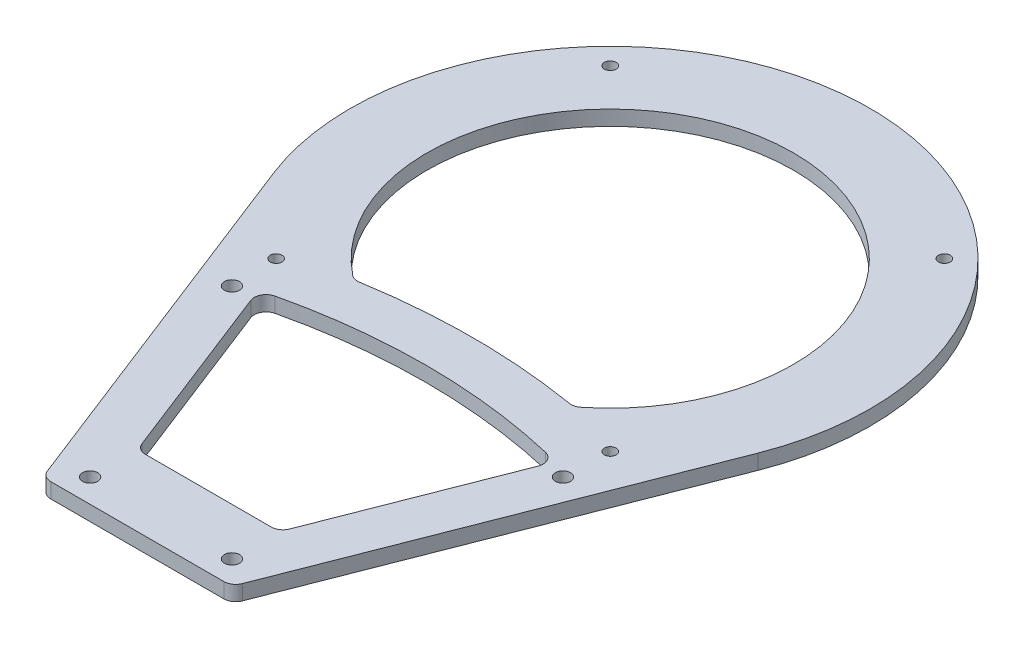
ISO-10303-21;
HEADER;
FILE_DESCRIPTION(('STEP AP214'),'2;1');
FILE_NAME('part.step','',(''),(''),'','','');
FILE_SCHEMA(('AUTOMOTIVE_DESIGN { 1 0 10303 214 1 1 1 1 }'));
ENDSEC;
DATA;
#1=APPLICATION_CONTEXT('core data for automotive mechanical design processes');
#2=APPLICATION_PROTOCOL_DEFINITION('international standard','automotive_design',2000,#1);
#3=PRODUCT_CONTEXT('',#1,'mechanical');
#4=PRODUCT('Part','Part','',(#3));
#5=PRODUCT_RELATED_PRODUCT_CATEGORY('part','',(#4));
#6=PRODUCT_DEFINITION_FORMATION('','',#4);
#7=PRODUCT_DEFINITION_CONTEXT('part definition',#1,'design');
#8=PRODUCT_DEFINITION('design','',#6,#7);
#9=PRODUCT_DEFINITION_SHAPE('','',#8);
#10=(LENGTH_UNIT() NAMED_UNIT(*) SI_UNIT(.MILLI.,.METRE.));
#11=(NAMED_UNIT(*) PLANE_ANGLE_UNIT() SI_UNIT($,.RADIAN.));
#12=(NAMED_UNIT(*) SI_UNIT($,.STERADIAN.) SOLID_ANGLE_UNIT());
#13=UNCERTAINTY_MEASURE_WITH_UNIT(LENGTH_MEASURE(1.E-05),#10,'distance_accuracy_value','');
#14=(GEOMETRIC_REPRESENTATION_CONTEXT(3) GLOBAL_UNCERTAINTY_ASSIGNED_CONTEXT((#13)) GLOBAL_UNIT_ASSIGNED_CONTEXT((#10,
#11,#12)) REPRESENTATION_CONTEXT('',''));
#15=CARTESIAN_POINT('',(0.,0.,0.));
#16=DIRECTION('',(0.,0.,1.));
#17=DIRECTION('',(1.,0.,0.));
#18=AXIS2_PLACEMENT_3D('',#15,#16,#17);
#19=CARTESIAN_POINT('',(0.,0.,0.));
#20=DIRECTION('',(0.,-1.,0.));
#21=DIRECTION('',(0.,0.,-1.));
#22=AXIS2_PLACEMENT_3D('',#19,#20,#21);
#23=PLANE('',#22);
#24=CARTESIAN_POINT('',(-70.64375,0.,70.64375));
#25=DIRECTION('',(0.,1.,0.));
#26=DIRECTION('',(0.,0.,1.));
#27=AXIS2_PLACEMENT_3D('',#24,#25,#26);
#28=CIRCLE('',#27,2.5);
#29=CARTESIAN_POINT('',(-70.64375,0.,73.14375));
#30=VERTEX_POINT('',#29);
#31=EDGE_CURVE('E503',#30,#30,#28,.T.);
#32=ORIENTED_EDGE('',*,*,#31,.F.);
#33=EDGE_LOOP('',(#32));
#34=FACE_BOUND('',#33,.T.);
#35=CARTESIAN_POINT('',(-70.64375,0.,-70.64375));
#36=DIRECTION('',(0.,1.,0.));
#37=DIRECTION('',(0.,0.,1.));
#38=AXIS2_PLACEMENT_3D('',#35,#36,#37);
#39=CIRCLE('',#38,2.5);
#40=CARTESIAN_POINT('',(-70.64375,0.,-68.14375));
#41=VERTEX_POINT('',#40);
#42=EDGE_CURVE('E507',#41,#41,#39,.T.);
#43=ORIENTED_EDGE('',*,*,#42,.F.);
#44=EDGE_LOOP('',(#43));
#45=FACE_BOUND('',#44,.T.);
#46=CARTESIAN_POINT('',(70.64375,0.,-70.64375));
#47=DIRECTION('',(0.,1.,0.));
#48=DIRECTION('',(0.,0.,1.));
#49=AXIS2_PLACEMENT_3D('',#46,#47,#48);
#50=CIRCLE('',#49,2.5);
#51=CARTESIAN_POINT('',(70.64375,0.,-68.14375));
#52=VERTEX_POINT('',#51);
#53=EDGE_CURVE('E517',#52,#52,#50,.T.);
#54=ORIENTED_EDGE('',*,*,#53,.F.);
#55=EDGE_LOOP('',(#54));
#56=FACE_BOUND('',#55,.T.);
#57=CARTESIAN_POINT('',(-70.,0.,90.));
#58=DIRECTION('',(0.,1.,0.));
#59=DIRECTION('',(0.,0.,1.));
#60=AXIS2_PLACEMENT_3D('',#57,#58,#59);
#61=CIRCLE('',#60,3.19999999999999);
#62=CARTESIAN_POINT('',(-70.,0.,93.2));
#63=VERTEX_POINT('',#62);
#64=EDGE_CURVE('E533',#63,#63,#61,.T.);
#65=ORIENTED_EDGE('',*,*,#64,.F.);
#66=EDGE_LOOP('',(#65));
#67=FACE_BOUND('',#66,.T.);
#68=CARTESIAN_POINT('',(-30.,0.,190.));
#69=DIRECTION('',(0.,1.,0.));
#70=DIRECTION('',(0.,0.,1.));
#71=AXIS2_PLACEMENT_3D('',#68,#69,#70);
#72=CIRCLE('',#71,3.19999999999999);
#73=CARTESIAN_POINT('',(-30.,0.,193.2));
#74=VERTEX_POINT('',#73);
#75=EDGE_CURVE('E541',#74,#74,#72,.T.);
#76=ORIENTED_EDGE('',*,*,#75,.F.);
#77=EDGE_LOOP('',(#76));
#78=FACE_BOUND('',#77,.T.);
#79=CARTESIAN_POINT('',(30.,0.,190.));
#80=DIRECTION('',(0.,1.,0.));
#81=DIRECTION('',(0.,0.,1.));
#82=AXIS2_PLACEMENT_3D('',#79,#80,#81);
#83=CIRCLE('',#82,3.19999999999998);
#84=CARTESIAN_POINT('',(30.,0.,193.2));
#85=VERTEX_POINT('',#84);
#86=EDGE_CURVE('E549',#85,#85,#83,.T.);
#87=ORIENTED_EDGE('',*,*,#86,.F.);
#88=EDGE_LOOP('',(#87));
#89=FACE_BOUND('',#88,.T.);
#90=CARTESIAN_POINT('',(70.,0.,90.));
#91=DIRECTION('',(0.,1.,0.));
#92=DIRECTION('',(0.,0.,1.));
#93=AXIS2_PLACEMENT_3D('',#90,#91,#92);
#94=CIRCLE('',#93,3.19999999999999);
#95=CARTESIAN_POINT('',(70.,0.,93.1999999999999));
#96=VERTEX_POINT('',#95);
#97=EDGE_CURVE('E557',#96,#96,#94,.T.);
#98=ORIENTED_EDGE('',*,*,#97,.F.);
#99=EDGE_LOOP('',(#98));
#100=FACE_BOUND('',#99,.T.);
#101=DIRECTION('',(1.,0.,0.));
#102=VECTOR('',#101,1.);
#103=CARTESIAN_POINT('',(-30.,0.,170.));
#104=LINE('',#103,#102);
#105=CARTESIAN_POINT('',(-26.5845864455939,0.,170.));
#106=VERTEX_POINT('',#105);
#107=CARTESIAN_POINT('',(26.5845864455939,0.,170.));
#108=VERTEX_POINT('',#107);
#109=EDGE_CURVE('E410',#106,#108,#104,.T.);
#110=ORIENTED_EDGE('',*,*,#109,.F.);
#111=CARTESIAN_POINT('',(-26.5845864455939,0.,165.));
#112=DIRECTION('',(0.,-1.,0.));
#113=DIRECTION('',(0.,0.,-1.));
#114=AXIS2_PLACEMENT_3D('',#111,#112,#113);
#115=CIRCLE('',#114,5.);
#116=CARTESIAN_POINT('',(-31.2421739545645,0.,166.818482498206));
#117=VERTEX_POINT('',#116);
#118=EDGE_CURVE('E285',#106,#117,#115,.T.);
#119=ORIENTED_EDGE('',*,*,#118,.T.);
#120=DIRECTION('',(0.363696499641176,0.,0.931517501794119));
#121=VECTOR('',#120,1.);
#122=CARTESIAN_POINT('',(-62.7964916504714,0.,86.));
#123=LINE('',#122,#121);
#124=CARTESIAN_POINT('',(-60.7252595959383,0.,91.3049422003734));
#125=VERTEX_POINT('',#124);
#126=EDGE_CURVE('E406',#125,#117,#123,.T.);
#127=ORIENTED_EDGE('',*,*,#126,.F.);
#128=CARTESIAN_POINT('',(-56.0676720869678,0.,89.4864597021676));
#129=DIRECTION('',(0.,-1.,0.));
#130=DIRECTION('',(0.,0.,-1.));
#131=AXIS2_PLACEMENT_3D('',#128,#129,#130);
#132=CIRCLE('',#131,5.);
#133=CARTESIAN_POINT('',(-57.2119102928242,0.,84.6191484394416));
#134=VERTEX_POINT('',#133);
#135=EDGE_CURVE('E279',#125,#134,#132,.T.);
#136=ORIENTED_EDGE('',*,*,#135,.T.);
#137=CARTESIAN_POINT('',(0.,0.,327.984711575736));
#138=DIRECTION('',(0.,1.,0.));
#139=DIRECTION('',(0.,0.,-1.));
#140=AXIS2_PLACEMENT_3D('',#137,#138,#139);
#141=CIRCLE('',#140,250.);
#142=CARTESIAN_POINT('',(57.2119102928242,0.,84.6191484394416));
#143=VERTEX_POINT('',#142);
#144=EDGE_CURVE('E418',#143,#134,#141,.T.);
#145=ORIENTED_EDGE('',*,*,#144,.F.);
#146=CARTESIAN_POINT('',(56.0676720869678,0.,89.4864597021676));
#147=DIRECTION('',(0.,-1.,0.));
#148=DIRECTION('',(0.,0.,-1.));
#149=AXIS2_PLACEMENT_3D('',#146,#147,#148);
#150=CIRCLE('',#149,5.);
#151=CARTESIAN_POINT('',(60.7252595959383,0.,91.3049422003735));
#152=VERTEX_POINT('',#151);
#153=EDGE_CURVE('E273',#143,#152,#150,.T.);
#154=ORIENTED_EDGE('',*,*,#153,.T.);
#155=DIRECTION('',(0.363696499641176,0.,-0.931517501794119));
#156=VECTOR('',#155,1.);
#157=CARTESIAN_POINT('',(30.,0.,170.));
#158=LINE('',#157,#156);
#159=CARTESIAN_POINT('',(31.2421739545645,0.,166.818482498206));
#160=VERTEX_POINT('',#159);
#161=EDGE_CURVE('E415',#160,#152,#158,.T.);
#162=ORIENTED_EDGE('',*,*,#161,.F.);
#163=CARTESIAN_POINT('',(26.5845864455939,0.,165.));
#164=DIRECTION('',(0.,-1.,0.));
#165=DIRECTION('',(0.,0.,-1.));
#166=AXIS2_PLACEMENT_3D('',#163,#164,#165);
#167=CIRCLE('',#166,5.);
#168=EDGE_CURVE('E291',#160,#108,#167,.T.);
#169=ORIENTED_EDGE('',*,*,#168,.T.);
#170=EDGE_LOOP('',(#110,#119,#127,#136,#145,#154,#162,#169));
#171=FACE_BOUND('',#170,.T.);
#172=CARTESIAN_POINT('',(0.,0.,327.984711575736));
#173=DIRECTION('',(0.,-1.,0.));
#174=DIRECTION('',(0.,0.,-1.));
#175=AXIS2_PLACEMENT_3D('',#172,#173,#174);
#176=CIRCLE('',#175,270.);
#177=CARTESIAN_POINT('',(-44.3378436870586,0.,61.6500431279693));
#178=VERTEX_POINT('',#177);
#179=CARTESIAN_POINT('',(44.3378436870587,0.,61.6500431279693));
#180=VERTEX_POINT('',#179);
#181=EDGE_CURVE('E200',#178,#180,#176,.T.);
#182=ORIENTED_EDGE('',*,*,#181,.F.);
#183=CARTESIAN_POINT('',(-45.1589148664486,0.,56.7179196381958));
#184=DIRECTION('',(0.,-1.,0.));
#185=DIRECTION('',(0.,0.,-1.));
#186=AXIS2_PLACEMENT_3D('',#183,#184,#185);
#187=CIRCLE('',#186,5.);
#188=CARTESIAN_POINT('',(-48.2733227882727,0.,60.6295003028991));
#189=VERTEX_POINT('',#188);
#190=EDGE_CURVE('E267',#178,#189,#187,.T.);
#191=ORIENTED_EDGE('',*,*,#190,.T.);
#192=CARTESIAN_POINT('',(0.,0.,0.));
#193=DIRECTION('',(0.,1.,0.));
#194=DIRECTION('',(0.,0.,-1.));
#195=AXIS2_PLACEMENT_3D('',#192,#193,#194);
#196=CIRCLE('',#195,77.5);
#197=CARTESIAN_POINT('',(48.2733227882727,0.,60.629500302899));
#198=VERTEX_POINT('',#197);
#199=EDGE_CURVE('E400',#198,#189,#196,.T.);
#200=ORIENTED_EDGE('',*,*,#199,.F.);
#201=CARTESIAN_POINT('',(45.1589148664487,0.,56.7179196381959));
#202=DIRECTION('',(0.,-1.,0.));
#203=DIRECTION('',(0.,0.,-1.));
#204=AXIS2_PLACEMENT_3D('',#201,#202,#203);
#205=CIRCLE('',#204,5.);
#206=EDGE_CURVE('E261',#198,#180,#205,.T.);
#207=ORIENTED_EDGE('',*,*,#206,.T.);
#208=EDGE_LOOP('',(#182,#191,#200,#207));
#209=FACE_BOUND('',#208,.T.);
#210=DIRECTION('',(1.,0.,0.));
#211=VECTOR('',#210,1.);
#212=CARTESIAN_POINT('',(-40.,0.,200.));
#213=LINE('',#212,#211);
#214=CARTESIAN_POINT('',(-36.5845864455939,0.,200.));
#215=VERTEX_POINT('',#214);
#216=CARTESIAN_POINT('',(36.5845864455939,0.,200.));
#217=VERTEX_POINT('',#216);
#218=EDGE_CURVE('E197',#215,#217,#213,.T.);
#219=ORIENTED_EDGE('',*,*,#218,.T.);
#220=CARTESIAN_POINT('',(36.5845864455939,0.,195.));
#221=DIRECTION('',(0.,-1.,0.));
#222=DIRECTION('',(0.,0.,-1.));
#223=AXIS2_PLACEMENT_3D('',#220,#221,#222);
#224=CIRCLE('',#223,5.);
#225=CARTESIAN_POINT('',(41.2421739545645,0.,196.818482498206));
#226=VERTEX_POINT('',#225);
#227=EDGE_CURVE('E307',#217,#226,#224,.F.);
#228=ORIENTED_EDGE('',*,*,#227,.T.);
#229=DIRECTION('',(0.363696499641176,0.,-0.931517501794119));
#230=VECTOR('',#229,1.);
#231=CARTESIAN_POINT('',(40.,0.,200.));
#232=LINE('',#231,#230);
#233=CARTESIAN_POINT('',(102.466925197353,0.,40.0066149605294));
#234=VERTEX_POINT('',#233);
#235=EDGE_CURVE('E194',#226,#234,#232,.T.);
#236=ORIENTED_EDGE('',*,*,#235,.T.);
#237=CARTESIAN_POINT('',(0.,0.,0.));
#238=DIRECTION('',(0.,1.,0.));
#239=DIRECTION('',(0.,0.,-1.));
#240=AXIS2_PLACEMENT_3D('',#237,#238,#239);
#241=CIRCLE('',#240,110.);
#242=CARTESIAN_POINT('',(-102.466925197353,0.,40.0066149605293));
#243=VERTEX_POINT('',#242);
#244=EDGE_CURVE('E208',#234,#243,#241,.T.);
#245=ORIENTED_EDGE('',*,*,#244,.T.);
#246=DIRECTION('',(0.363696499641176,0.,0.931517501794119));
#247=VECTOR('',#246,1.);
#248=CARTESIAN_POINT('',(-102.466925197353,0.,40.0066149605293));
#249=LINE('',#248,#247);
#250=CARTESIAN_POINT('',(-41.2421739545645,0.,196.818482498206));
#251=VERTEX_POINT('',#250);
#252=EDGE_CURVE('E174',#243,#251,#249,.T.);
#253=ORIENTED_EDGE('',*,*,#252,.T.);
#254=CARTESIAN_POINT('',(-36.5845864455939,0.,195.));
#255=DIRECTION('',(0.,-1.,0.));
#256=DIRECTION('',(0.,0.,-1.));
#257=AXIS2_PLACEMENT_3D('',#254,#255,#256);
#258=CIRCLE('',#257,5.);
#259=EDGE_CURVE('E304',#251,#215,#258,.F.);
#260=ORIENTED_EDGE('',*,*,#259,.T.);
#261=EDGE_LOOP('',(#219,#228,#236,#245,#253,#260));
#262=FACE_BOUND('',#261,.T.);
#263=CARTESIAN_POINT('',(70.64375,0.,70.64375));
#264=DIRECTION('',(0.,1.,0.));
#265=DIRECTION('',(0.,0.,1.));
#266=AXIS2_PLACEMENT_3D('',#263,#264,#265);
#267=CIRCLE('',#266,2.5);
#268=CARTESIAN_POINT('',(70.64375,0.,73.14375));
#269=VERTEX_POINT('',#268);
#270=EDGE_CURVE('E525',#269,#269,#267,.T.);
#271=ORIENTED_EDGE('',*,*,#270,.F.);
#272=EDGE_LOOP('',(#271));
#273=FACE_BOUND('',#272,.T.);
#274=ADVANCED_FACE('F41',(#34,#45,#56,#67,#78,#89,#100,#171,#209,#262,#273),#23,.F.);
#275=CARTESIAN_POINT('',(0.,-6.35,0.));
#276=DIRECTION('',(0.,-1.,0.));
#277=DIRECTION('',(0.,0.,-1.));
#278=AXIS2_PLACEMENT_3D('',#275,#276,#277);
#279=PLANE('',#278);
#280=CARTESIAN_POINT('',(-70.64375,-6.35,70.64375));
#281=DIRECTION('',(0.,1.,0.));
#282=DIRECTION('',(0.,0.,1.));
#283=AXIS2_PLACEMENT_3D('',#280,#281,#282);
#284=CIRCLE('',#283,2.5);
#285=CARTESIAN_POINT('',(-70.64375,-6.35,73.14375));
#286=VERTEX_POINT('',#285);
#287=EDGE_CURVE('E501',#286,#286,#284,.T.);
#288=ORIENTED_EDGE('',*,*,#287,.T.);
#289=EDGE_LOOP('',(#288));
#290=FACE_BOUND('',#289,.T.);
#291=CARTESIAN_POINT('',(-70.64375,-6.35,-70.64375));
#292=DIRECTION('',(0.,1.,0.));
#293=DIRECTION('',(0.,0.,1.));
#294=AXIS2_PLACEMENT_3D('',#291,#292,#293);
#295=CIRCLE('',#294,2.5);
#296=CARTESIAN_POINT('',(-70.64375,-6.35,-68.14375));
#297=VERTEX_POINT('',#296);
#298=EDGE_CURVE('E513',#297,#297,#295,.T.);
#299=ORIENTED_EDGE('',*,*,#298,.T.);
#300=EDGE_LOOP('',(#299));
#301=FACE_BOUND('',#300,.T.);
#302=CARTESIAN_POINT('',(70.64375,-6.35,-70.64375));
#303=DIRECTION('',(0.,1.,0.));
#304=DIRECTION('',(0.,0.,1.));
#305=AXIS2_PLACEMENT_3D('',#302,#303,#304);
#306=CIRCLE('',#305,2.5);
#307=CARTESIAN_POINT('',(70.64375,-6.35,-68.14375));
#308=VERTEX_POINT('',#307);
#309=EDGE_CURVE('E521',#308,#308,#306,.T.);
#310=ORIENTED_EDGE('',*,*,#309,.T.);
#311=EDGE_LOOP('',(#310));
#312=FACE_BOUND('',#311,.T.);
#313=CARTESIAN_POINT('',(70.64375,-6.35,70.64375));
#314=DIRECTION('',(0.,1.,0.));
#315=DIRECTION('',(0.,0.,1.));
#316=AXIS2_PLACEMENT_3D('',#313,#314,#315);
#317=CIRCLE('',#316,2.5);
#318=CARTESIAN_POINT('',(70.64375,-6.35,73.14375));
#319=VERTEX_POINT('',#318);
#320=EDGE_CURVE('E529',#319,#319,#317,.T.);
#321=ORIENTED_EDGE('',*,*,#320,.T.);
#322=EDGE_LOOP('',(#321));
#323=FACE_BOUND('',#322,.T.);
#324=CARTESIAN_POINT('',(-70.,-6.34999999999999,90.));
#325=DIRECTION('',(0.,1.,0.));
#326=DIRECTION('',(0.,0.,1.));
#327=AXIS2_PLACEMENT_3D('',#324,#325,#326);
#328=CIRCLE('',#327,3.19999999999999);
#329=CARTESIAN_POINT('',(-70.,-6.34999999999999,93.2));
#330=VERTEX_POINT('',#329);
#331=EDGE_CURVE('E537',#330,#330,#328,.T.);
#332=ORIENTED_EDGE('',*,*,#331,.T.);
#333=EDGE_LOOP('',(#332));
#334=FACE_BOUND('',#333,.T.);
#335=CARTESIAN_POINT('',(-30.,-6.34999999999999,190.));
#336=DIRECTION('',(0.,1.,0.));
#337=DIRECTION('',(0.,0.,1.));
#338=AXIS2_PLACEMENT_3D('',#335,#336,#337);
#339=CIRCLE('',#338,3.19999999999999);
#340=CARTESIAN_POINT('',(-30.,-6.34999999999999,193.2));
#341=VERTEX_POINT('',#340);
#342=EDGE_CURVE('E545',#341,#341,#339,.T.);
#343=ORIENTED_EDGE('',*,*,#342,.T.);
#344=EDGE_LOOP('',(#343));
#345=FACE_BOUND('',#344,.T.);
#346=CARTESIAN_POINT('',(30.,-6.34999999999999,190.));
#347=DIRECTION('',(0.,1.,0.));
#348=DIRECTION('',(0.,0.,1.));
#349=AXIS2_PLACEMENT_3D('',#346,#347,#348);
#350=CIRCLE('',#349,3.19999999999998);
#351=CARTESIAN_POINT('',(30.,-6.34999999999999,193.2));
#352=VERTEX_POINT('',#351);
#353=EDGE_CURVE('E553',#352,#352,#350,.T.);
#354=ORIENTED_EDGE('',*,*,#353,.T.);
#355=EDGE_LOOP('',(#354));
#356=FACE_BOUND('',#355,.T.);
#357=DIRECTION('',(0.363696499641176,0.,-0.931517501794119));
#358=VECTOR('',#357,1.);
#359=CARTESIAN_POINT('',(40.,-6.35,200.));
#360=LINE('',#359,#358);
#361=CARTESIAN_POINT('',(41.2421739545645,-6.35,196.818482498206));
#362=VERTEX_POINT('',#361);
#363=CARTESIAN_POINT('',(102.466925197353,-6.35,40.0066149605294));
#364=VERTEX_POINT('',#363);
#365=EDGE_CURVE('E181',#362,#364,#360,.T.);
#366=ORIENTED_EDGE('',*,*,#365,.F.);
#367=CARTESIAN_POINT('',(36.5845864455939,-6.35,195.));
#368=DIRECTION('',(0.,-1.,0.));
#369=DIRECTION('',(0.,0.,-1.));
#370=AXIS2_PLACEMENT_3D('',#367,#368,#369);
#371=CIRCLE('',#370,5.);
#372=CARTESIAN_POINT('',(36.5845864455939,-6.35,200.));
#373=VERTEX_POINT('',#372);
#374=EDGE_CURVE('E50',#362,#373,#371,.T.);
#375=ORIENTED_EDGE('',*,*,#374,.T.);
#376=DIRECTION('',(1.,0.,0.));
#377=VECTOR('',#376,1.);
#378=CARTESIAN_POINT('',(-40.,-6.35,200.));
#379=LINE('',#378,#377);
#380=CARTESIAN_POINT('',(-36.5845864455939,-6.35,200.));
#381=VERTEX_POINT('',#380);
#382=EDGE_CURVE('E188',#381,#373,#379,.T.);
#383=ORIENTED_EDGE('',*,*,#382,.F.);
#384=CARTESIAN_POINT('',(-36.5845864455939,-6.35,195.));
#385=DIRECTION('',(0.,-1.,0.));
#386=DIRECTION('',(0.,0.,-1.));
#387=AXIS2_PLACEMENT_3D('',#384,#385,#386);
#388=CIRCLE('',#387,5.);
#389=CARTESIAN_POINT('',(-41.2421739545645,-6.35,196.818482498206));
#390=VERTEX_POINT('',#389);
#391=EDGE_CURVE('E57',#381,#390,#388,.T.);
#392=ORIENTED_EDGE('',*,*,#391,.T.);
#393=DIRECTION('',(0.363696499641176,0.,0.931517501794119));
#394=VECTOR('',#393,1.);
#395=CARTESIAN_POINT('',(-102.466925197353,-6.35,40.0066149605293));
#396=LINE('',#395,#394);
#397=CARTESIAN_POINT('',(-102.466925197353,-6.35,40.0066149605293));
#398=VERTEX_POINT('',#397);
#399=EDGE_CURVE('E171',#398,#390,#396,.T.);
#400=ORIENTED_EDGE('',*,*,#399,.F.);
#401=CARTESIAN_POINT('',(0.,-6.35,0.));
#402=DIRECTION('',(0.,1.,0.));
#403=DIRECTION('',(0.,0.,-1.));
#404=AXIS2_PLACEMENT_3D('',#401,#402,#403);
#405=CIRCLE('',#404,110.);
#406=EDGE_CURVE('E186',#364,#398,#405,.T.);
#407=ORIENTED_EDGE('',*,*,#406,.F.);
#408=EDGE_LOOP('',(#366,#375,#383,#392,#400,#407));
#409=FACE_BOUND('',#408,.T.);
#410=CARTESIAN_POINT('',(0.,-6.35,327.984711575736));
#411=DIRECTION('',(0.,-1.,0.));
#412=DIRECTION('',(0.,0.,-1.));
#413=AXIS2_PLACEMENT_3D('',#410,#411,#412);
#414=CIRCLE('',#413,270.);
#415=CARTESIAN_POINT('',(-44.3378436870586,-6.35,61.6500431279693));
#416=VERTEX_POINT('',#415);
#417=CARTESIAN_POINT('',(44.3378436870587,-6.35,61.6500431279693));
#418=VERTEX_POINT('',#417);
#419=EDGE_CURVE('E211',#416,#418,#414,.T.);
#420=ORIENTED_EDGE('',*,*,#419,.T.);
#421=CARTESIAN_POINT('',(45.1589148664487,-6.35,56.7179196381959));
#422=DIRECTION('',(0.,-1.,0.));
#423=DIRECTION('',(0.,0.,-1.));
#424=AXIS2_PLACEMENT_3D('',#421,#422,#423);
#425=CIRCLE('',#424,5.);
#426=CARTESIAN_POINT('',(48.2733227882727,-6.35,60.629500302899));
#427=VERTEX_POINT('',#426);
#428=EDGE_CURVE('E264',#418,#427,#425,.F.);
#429=ORIENTED_EDGE('',*,*,#428,.T.);
#430=CARTESIAN_POINT('',(0.,-6.35,0.));
#431=DIRECTION('',(0.,1.,0.));
#432=DIRECTION('',(0.,0.,-1.));
#433=AXIS2_PLACEMENT_3D('',#430,#431,#432);
#434=CIRCLE('',#433,77.5);
#435=CARTESIAN_POINT('',(-48.2733227882727,-6.35,60.6295003028991));
#436=VERTEX_POINT('',#435);
#437=EDGE_CURVE('E422',#427,#436,#434,.T.);
#438=ORIENTED_EDGE('',*,*,#437,.T.);
#439=CARTESIAN_POINT('',(-45.1589148664486,-6.35,56.7179196381958));
#440=DIRECTION('',(0.,-1.,0.));
#441=DIRECTION('',(0.,0.,-1.));
#442=AXIS2_PLACEMENT_3D('',#439,#440,#441);
#443=CIRCLE('',#442,5.);
#444=EDGE_CURVE('E270',#436,#416,#443,.F.);
#445=ORIENTED_EDGE('',*,*,#444,.T.);
#446=EDGE_LOOP('',(#420,#429,#438,#445));
#447=FACE_BOUND('',#446,.T.);
#448=CARTESIAN_POINT('',(0.,-6.35,327.984711575736));
#449=DIRECTION('',(0.,1.,0.));
#450=DIRECTION('',(0.,0.,-1.));
#451=AXIS2_PLACEMENT_3D('',#448,#449,#450);
#452=CIRCLE('',#451,250.);
#453=CARTESIAN_POINT('',(57.2119102928242,-6.35,84.6191484394416));
#454=VERTEX_POINT('',#453);
#455=CARTESIAN_POINT('',(-57.2119102928242,-6.35,84.6191484394416));
#456=VERTEX_POINT('',#455);
#457=EDGE_CURVE('E396',#454,#456,#452,.T.);
#458=ORIENTED_EDGE('',*,*,#457,.T.);
#459=CARTESIAN_POINT('',(-56.0676720869678,-6.35,89.4864597021676));
#460=DIRECTION('',(0.,-1.,0.));
#461=DIRECTION('',(0.,0.,-1.));
#462=AXIS2_PLACEMENT_3D('',#459,#460,#461);
#463=CIRCLE('',#462,5.);
#464=CARTESIAN_POINT('',(-60.7252595959383,-6.35,91.3049422003734));
#465=VERTEX_POINT('',#464);
#466=EDGE_CURVE('E282',#456,#465,#463,.F.);
#467=ORIENTED_EDGE('',*,*,#466,.T.);
#468=DIRECTION('',(0.363696499641176,0.,0.931517501794119));
#469=VECTOR('',#468,1.);
#470=CARTESIAN_POINT('',(-62.7964916504714,-6.35,86.));
#471=LINE('',#470,#469);
#472=CARTESIAN_POINT('',(-31.2421739545645,-6.35,166.818482498206));
#473=VERTEX_POINT('',#472);
#474=EDGE_CURVE('E402',#465,#473,#471,.T.);
#475=ORIENTED_EDGE('',*,*,#474,.T.);
#476=CARTESIAN_POINT('',(-26.5845864455939,-6.35,165.));
#477=DIRECTION('',(0.,-1.,0.));
#478=DIRECTION('',(0.,0.,-1.));
#479=AXIS2_PLACEMENT_3D('',#476,#477,#478);
#480=CIRCLE('',#479,5.);
#481=CARTESIAN_POINT('',(-26.5845864455939,-6.35,170.));
#482=VERTEX_POINT('',#481);
#483=EDGE_CURVE('E288',#473,#482,#480,.F.);
#484=ORIENTED_EDGE('',*,*,#483,.T.);
#485=DIRECTION('',(1.,0.,0.));
#486=VECTOR('',#485,1.);
#487=CARTESIAN_POINT('',(-30.,-6.35,170.));
#488=LINE('',#487,#486);
#489=CARTESIAN_POINT('',(26.5845864455939,-6.35,170.));
#490=VERTEX_POINT('',#489);
#491=EDGE_CURVE('E389',#482,#490,#488,.T.);
#492=ORIENTED_EDGE('',*,*,#491,.T.);
#493=CARTESIAN_POINT('',(26.5845864455939,-6.35,165.));
#494=DIRECTION('',(0.,-1.,0.));
#495=DIRECTION('',(0.,0.,-1.));
#496=AXIS2_PLACEMENT_3D('',#493,#494,#495);
#497=CIRCLE('',#496,5.);
#498=CARTESIAN_POINT('',(31.2421739545645,-6.35,166.818482498206));
#499=VERTEX_POINT('',#498);
#500=EDGE_CURVE('E294',#490,#499,#497,.F.);
#501=ORIENTED_EDGE('',*,*,#500,.T.);
#502=DIRECTION('',(0.363696499641176,0.,-0.931517501794119));
#503=VECTOR('',#502,1.);
#504=CARTESIAN_POINT('',(30.,-6.35,170.));
#505=LINE('',#504,#503);
#506=CARTESIAN_POINT('',(60.7252595959383,-6.35,91.3049422003735));
#507=VERTEX_POINT('',#506);
#508=EDGE_CURVE('E386',#499,#507,#505,.T.);
#509=ORIENTED_EDGE('',*,*,#508,.T.);
#510=CARTESIAN_POINT('',(56.0676720869678,-6.35,89.4864597021676));
#511=DIRECTION('',(0.,-1.,0.));
#512=DIRECTION('',(0.,0.,-1.));
#513=AXIS2_PLACEMENT_3D('',#510,#511,#512);
#514=CIRCLE('',#513,5.);
#515=EDGE_CURVE('E276',#507,#454,#514,.F.);
#516=ORIENTED_EDGE('',*,*,#515,.T.);
#517=EDGE_LOOP('',(#458,#467,#475,#484,#492,#501,#509,#516));
#518=FACE_BOUND('',#517,.T.);
#519=CARTESIAN_POINT('',(70.,-6.34999999999999,90.));
#520=DIRECTION('',(0.,1.,0.));
#521=DIRECTION('',(0.,0.,1.));
#522=AXIS2_PLACEMENT_3D('',#519,#520,#521);
#523=CIRCLE('',#522,3.19999999999999);
#524=CARTESIAN_POINT('',(70.,-6.34999999999999,93.1999999999999));
#525=VERTEX_POINT('',#524);
#526=EDGE_CURVE('E411',#525,#525,#523,.T.);
#527=ORIENTED_EDGE('',*,*,#526,.T.);
#528=EDGE_LOOP('',(#527));
#529=FACE_BOUND('',#528,.T.);
#530=ADVANCED_FACE('F184',(#290,#301,#312,#323,#334,#345,#356,#409,#447,#518,#529),#279,.T.);
#531=CARTESIAN_POINT('',(0.,-6.35,0.));
#532=DIRECTION('',(0.,1.,0.));
#533=DIRECTION('',(0.,0.,1.));
#534=AXIS2_PLACEMENT_3D('',#531,#532,#533);
#535=CYLINDRICAL_SURFACE('',#534,110.);
#536=ORIENTED_EDGE('',*,*,#244,.F.);
#537=DIRECTION('',(0.,1.,0.));
#538=VECTOR('',#537,1.);
#539=CARTESIAN_POINT('',(102.466925197353,-6.35,40.0066149605294));
#540=LINE('',#539,#538);
#541=EDGE_CURVE('E180',#364,#234,#540,.T.);
#542=ORIENTED_EDGE('',*,*,#541,.F.);
#543=ORIENTED_EDGE('',*,*,#406,.T.);
#544=DIRECTION('',(0.,1.,0.));
#545=VECTOR('',#544,1.);
#546=CARTESIAN_POINT('',(-102.466925197353,-6.35,40.0066149605293));
#547=LINE('',#546,#545);
#548=EDGE_CURVE('E169',#398,#243,#547,.T.);
#549=ORIENTED_EDGE('',*,*,#548,.T.);
#550=EDGE_LOOP('',(#536,#542,#543,#549));
#551=FACE_BOUND('',#550,.T.);
#552=ADVANCED_FACE('F191',(#551),#535,.T.);
#553=CARTESIAN_POINT('',(40.,-6.35,200.));
#554=DIRECTION('',(0.931517501794119,0.,0.363696499641176));
#555=DIRECTION('',(0.363696499641176,0.,-0.931517501794119));
#556=AXIS2_PLACEMENT_3D('',#553,#554,#555);
#557=PLANE('',#556);
#558=ORIENTED_EDGE('',*,*,#235,.F.);
#559=DIRECTION('',(0.,1.,0.));
#560=VECTOR('',#559,1.);
#561=CARTESIAN_POINT('',(41.2421739545645,-6.35,196.818482498206));
#562=LINE('',#561,#560);
#563=EDGE_CURVE('E65',#226,#362,#562,.F.);
#564=ORIENTED_EDGE('',*,*,#563,.T.);
#565=ORIENTED_EDGE('',*,*,#365,.T.);
#566=ORIENTED_EDGE('',*,*,#541,.T.);
#567=EDGE_LOOP('',(#558,#564,#565,#566));
#568=FACE_BOUND('',#567,.T.);
#569=ADVANCED_FACE('F324',(#568),#557,.T.);
#570=CARTESIAN_POINT('',(-40.,-6.35,200.));
#571=DIRECTION('',(0.,0.,1.));
#572=DIRECTION('',(1.,0.,0.));
#573=AXIS2_PLACEMENT_3D('',#570,#571,#572);
#574=PLANE('',#573);
#575=ORIENTED_EDGE('',*,*,#382,.T.);
#576=DIRECTION('',(0.,1.,0.));
#577=VECTOR('',#576,1.);
#578=CARTESIAN_POINT('',(36.5845864455939,-6.35,200.));
#579=LINE('',#578,#577);
#580=EDGE_CURVE('E300',#373,#217,#579,.T.);
#581=ORIENTED_EDGE('',*,*,#580,.T.);
#582=ORIENTED_EDGE('',*,*,#218,.F.);
#583=DIRECTION('',(0.,1.,0.));
#584=VECTOR('',#583,1.);
#585=CARTESIAN_POINT('',(-36.5845864455939,-6.35,200.));
#586=LINE('',#585,#584);
#587=EDGE_CURVE('E297',#215,#381,#586,.F.);
#588=ORIENTED_EDGE('',*,*,#587,.T.);
#589=EDGE_LOOP('',(#575,#581,#582,#588));
#590=FACE_BOUND('',#589,.T.);
#591=ADVANCED_FACE('F318',(#590),#574,.T.);
#592=CARTESIAN_POINT('',(-102.466925197353,-6.35,40.0066149605293));
#593=DIRECTION('',(-0.931517501794119,0.,0.363696499641176));
#594=DIRECTION('',(0.363696499641176,0.,0.931517501794119));
#595=AXIS2_PLACEMENT_3D('',#592,#593,#594);
#596=PLANE('',#595);
#597=ORIENTED_EDGE('',*,*,#399,.T.);
#598=DIRECTION('',(0.,1.,0.));
#599=VECTOR('',#598,1.);
#600=CARTESIAN_POINT('',(-41.2421739545645,-6.35,196.818482498206));
#601=LINE('',#600,#599);
#602=EDGE_CURVE('E11',#390,#251,#601,.T.);
#603=ORIENTED_EDGE('',*,*,#602,.T.);
#604=ORIENTED_EDGE('',*,*,#252,.F.);
#605=ORIENTED_EDGE('',*,*,#548,.F.);
#606=EDGE_LOOP('',(#597,#603,#604,#605));
#607=FACE_BOUND('',#606,.T.);
#608=ADVANCED_FACE('F170',(#607),#596,.T.);
#609=CARTESIAN_POINT('',(0.,-6.35,0.));
#610=DIRECTION('',(0.,1.,0.));
#611=DIRECTION('',(0.,0.,1.));
#612=AXIS2_PLACEMENT_3D('',#609,#610,#611);
#613=CYLINDRICAL_SURFACE('',#612,77.5);
#614=ORIENTED_EDGE('',*,*,#437,.F.);
#615=DIRECTION('',(0.,1.,0.));
#616=VECTOR('',#615,1.);
#617=CARTESIAN_POINT('',(48.2733227882727,-6.35,60.629500302899));
#618=LINE('',#617,#616);
#619=EDGE_CURVE('E222',#427,#198,#618,.T.);
#620=ORIENTED_EDGE('',*,*,#619,.T.);
#621=ORIENTED_EDGE('',*,*,#199,.T.);
#622=DIRECTION('',(0.,1.,0.));
#623=VECTOR('',#622,1.);
#624=CARTESIAN_POINT('',(-48.2733227882727,-6.35,60.6295003028991));
#625=LINE('',#624,#623);
#626=EDGE_CURVE('E218',#189,#436,#625,.F.);
#627=ORIENTED_EDGE('',*,*,#626,.T.);
#628=EDGE_LOOP('',(#614,#620,#621,#627));
#629=FACE_BOUND('',#628,.T.);
#630=ADVANCED_FACE('F349',(#629),#613,.F.);
#631=CARTESIAN_POINT('',(0.,-6.35,327.984711575736));
#632=DIRECTION('',(0.,1.,0.));
#633=DIRECTION('',(0.,0.,1.));
#634=AXIS2_PLACEMENT_3D('',#631,#632,#633);
#635=CYLINDRICAL_SURFACE('',#634,270.);
#636=ORIENTED_EDGE('',*,*,#181,.T.);
#637=DIRECTION('',(0.,1.,0.));
#638=VECTOR('',#637,1.);
#639=CARTESIAN_POINT('',(44.3378436870587,-6.35,61.6500431279693));
#640=LINE('',#639,#638);
#641=EDGE_CURVE('E230',#180,#418,#640,.F.);
#642=ORIENTED_EDGE('',*,*,#641,.T.);
#643=ORIENTED_EDGE('',*,*,#419,.F.);
#644=DIRECTION('',(0.,1.,0.));
#645=VECTOR('',#644,1.);
#646=CARTESIAN_POINT('',(-44.3378436870586,-6.35,61.6500431279693));
#647=LINE('',#646,#645);
#648=EDGE_CURVE('E226',#416,#178,#647,.T.);
#649=ORIENTED_EDGE('',*,*,#648,.T.);
#650=EDGE_LOOP('',(#636,#642,#643,#649));
#651=FACE_BOUND('',#650,.T.);
#652=ADVANCED_FACE('F438',(#651),#635,.T.);
#653=CARTESIAN_POINT('',(-62.7964916504714,-6.35,86.));
#654=DIRECTION('',(-0.931517501794119,0.,0.363696499641176));
#655=DIRECTION('',(0.363696499641176,0.,0.931517501794119));
#656=AXIS2_PLACEMENT_3D('',#653,#654,#655);
#657=PLANE('',#656);
#658=ORIENTED_EDGE('',*,*,#474,.F.);
#659=DIRECTION('',(0.,-1.,0.));
#660=VECTOR('',#659,1.);
#661=CARTESIAN_POINT('',(-60.7252595959383,0.,91.3049422003734));
#662=LINE('',#661,#660);
#663=EDGE_CURVE('E250',#465,#125,#662,.F.);
#664=ORIENTED_EDGE('',*,*,#663,.T.);
#665=ORIENTED_EDGE('',*,*,#126,.T.);
#666=DIRECTION('',(0.,1.,0.));
#667=VECTOR('',#666,1.);
#668=CARTESIAN_POINT('',(-31.2421739545645,-6.35,166.818482498206));
#669=LINE('',#668,#667);
#670=EDGE_CURVE('E247',#117,#473,#669,.F.);
#671=ORIENTED_EDGE('',*,*,#670,.T.);
#672=EDGE_LOOP('',(#658,#664,#665,#671));
#673=FACE_BOUND('',#672,.T.);
#674=ADVANCED_FACE('F450',(#673),#657,.F.);
#675=CARTESIAN_POINT('',(0.,-6.35,327.984711575736));
#676=DIRECTION('',(0.,1.,0.));
#677=DIRECTION('',(0.,0.,1.));
#678=AXIS2_PLACEMENT_3D('',#675,#676,#677);
#679=CYLINDRICAL_SURFACE('',#678,250.);
#680=ORIENTED_EDGE('',*,*,#457,.F.);
#681=DIRECTION('',(0.,1.,0.));
#682=VECTOR('',#681,1.);
#683=CARTESIAN_POINT('',(57.2119102928243,-6.35,84.6191484394416));
#684=LINE('',#683,#682);
#685=EDGE_CURVE('E236',#454,#143,#684,.T.);
#686=ORIENTED_EDGE('',*,*,#685,.T.);
#687=ORIENTED_EDGE('',*,*,#144,.T.);
#688=DIRECTION('',(0.,1.,0.));
#689=VECTOR('',#688,1.);
#690=CARTESIAN_POINT('',(-57.2119102928243,-6.35,84.6191484394416));
#691=LINE('',#690,#689);
#692=EDGE_CURVE('E233',#134,#456,#691,.F.);
#693=ORIENTED_EDGE('',*,*,#692,.T.);
#694=EDGE_LOOP('',(#680,#686,#687,#693));
#695=FACE_BOUND('',#694,.T.);
#696=ADVANCED_FACE('F455',(#695),#679,.F.);
#697=CARTESIAN_POINT('',(30.,-6.35,170.));
#698=DIRECTION('',(0.931517501794119,0.,0.363696499641176));
#699=DIRECTION('',(0.363696499641176,0.,-0.931517501794119));
#700=AXIS2_PLACEMENT_3D('',#697,#698,#699);
#701=PLANE('',#700);
#702=ORIENTED_EDGE('',*,*,#161,.T.);
#703=DIRECTION('',(0.,-1.,0.));
#704=VECTOR('',#703,1.);
#705=CARTESIAN_POINT('',(60.7252595959383,-6.35,91.3049422003734));
#706=LINE('',#705,#704);
#707=EDGE_CURVE('E244',#152,#507,#706,.T.);
#708=ORIENTED_EDGE('',*,*,#707,.T.);
#709=ORIENTED_EDGE('',*,*,#508,.F.);
#710=DIRECTION('',(0.,1.,0.));
#711=VECTOR('',#710,1.);
#712=CARTESIAN_POINT('',(31.2421739545645,0.,166.818482498206));
#713=LINE('',#712,#711);
#714=EDGE_CURVE('E240',#499,#160,#713,.T.);
#715=ORIENTED_EDGE('',*,*,#714,.T.);
#716=EDGE_LOOP('',(#702,#708,#709,#715));
#717=FACE_BOUND('',#716,.T.);
#718=ADVANCED_FACE('F392',(#717),#701,.F.);
#719=CARTESIAN_POINT('',(-30.,-6.35,170.));
#720=DIRECTION('',(0.,0.,1.));
#721=DIRECTION('',(1.,0.,0.));
#722=AXIS2_PLACEMENT_3D('',#719,#720,#721);
#723=PLANE('',#722);
#724=ORIENTED_EDGE('',*,*,#491,.F.);
#725=DIRECTION('',(0.,1.,0.));
#726=VECTOR('',#725,1.);
#727=CARTESIAN_POINT('',(-26.5845864455939,0.,170.));
#728=LINE('',#727,#726);
#729=EDGE_CURVE('E257',#482,#106,#728,.T.);
#730=ORIENTED_EDGE('',*,*,#729,.T.);
#731=ORIENTED_EDGE('',*,*,#109,.T.);
#732=DIRECTION('',(0.,1.,0.));
#733=VECTOR('',#732,1.);
#734=CARTESIAN_POINT('',(26.5845864455939,-6.35,170.));
#735=LINE('',#734,#733);
#736=EDGE_CURVE('E254',#108,#490,#735,.F.);
#737=ORIENTED_EDGE('',*,*,#736,.T.);
#738=EDGE_LOOP('',(#724,#730,#731,#737));
#739=FACE_BOUND('',#738,.T.);
#740=ADVANCED_FACE('F457',(#739),#723,.F.);
#741=CARTESIAN_POINT('',(70.,0.,90.));
#742=DIRECTION('',(0.,1.,0.));
#743=DIRECTION('',(0.,0.,1.));
#744=AXIS2_PLACEMENT_3D('',#741,#742,#743);
#745=CYLINDRICAL_SURFACE('',#744,3.19999999999999);
#746=ORIENTED_EDGE('',*,*,#526,.F.);
#747=EDGE_LOOP('',(#746));
#748=FACE_BOUND('',#747,.T.);
#749=ORIENTED_EDGE('',*,*,#97,.T.);
#750=EDGE_LOOP('',(#749));
#751=FACE_BOUND('',#750,.T.);
#752=ADVANCED_FACE('F460',(#748,#751),#745,.F.);
#753=CARTESIAN_POINT('',(30.,0.,190.));
#754=DIRECTION('',(0.,1.,0.));
#755=DIRECTION('',(0.,0.,1.));
#756=AXIS2_PLACEMENT_3D('',#753,#754,#755);
#757=CYLINDRICAL_SURFACE('',#756,3.19999999999998);
#758=ORIENTED_EDGE('',*,*,#353,.F.);
#759=EDGE_LOOP('',(#758));
#760=FACE_BOUND('',#759,.T.);
#761=ORIENTED_EDGE('',*,*,#86,.T.);
#762=EDGE_LOOP('',(#761));
#763=FACE_BOUND('',#762,.T.);
#764=ADVANCED_FACE('F469',(#760,#763),#757,.F.);
#765=CARTESIAN_POINT('',(-30.,0.,190.));
#766=DIRECTION('',(0.,1.,0.));
#767=DIRECTION('',(0.,0.,1.));
#768=AXIS2_PLACEMENT_3D('',#765,#766,#767);
#769=CYLINDRICAL_SURFACE('',#768,3.19999999999999);
#770=ORIENTED_EDGE('',*,*,#342,.F.);
#771=EDGE_LOOP('',(#770));
#772=FACE_BOUND('',#771,.T.);
#773=ORIENTED_EDGE('',*,*,#75,.T.);
#774=EDGE_LOOP('',(#773));
#775=FACE_BOUND('',#774,.T.);
#776=ADVANCED_FACE('F473',(#772,#775),#769,.F.);
#777=CARTESIAN_POINT('',(-70.,0.,90.));
#778=DIRECTION('',(0.,1.,0.));
#779=DIRECTION('',(0.,0.,1.));
#780=AXIS2_PLACEMENT_3D('',#777,#778,#779);
#781=CYLINDRICAL_SURFACE('',#780,3.19999999999999);
#782=ORIENTED_EDGE('',*,*,#331,.F.);
#783=EDGE_LOOP('',(#782));
#784=FACE_BOUND('',#783,.T.);
#785=ORIENTED_EDGE('',*,*,#64,.T.);
#786=EDGE_LOOP('',(#785));
#787=FACE_BOUND('',#786,.T.);
#788=ADVANCED_FACE('F477',(#784,#787),#781,.F.);
#789=CARTESIAN_POINT('',(70.64375,0.,70.64375));
#790=DIRECTION('',(0.,1.,0.));
#791=DIRECTION('',(0.,0.,1.));
#792=AXIS2_PLACEMENT_3D('',#789,#790,#791);
#793=CYLINDRICAL_SURFACE('',#792,2.5);
#794=ORIENTED_EDGE('',*,*,#320,.F.);
#795=EDGE_LOOP('',(#794));
#796=FACE_BOUND('',#795,.T.);
#797=ORIENTED_EDGE('',*,*,#270,.T.);
#798=EDGE_LOOP('',(#797));
#799=FACE_BOUND('',#798,.T.);
#800=ADVANCED_FACE('F481',(#796,#799),#793,.F.);
#801=CARTESIAN_POINT('',(70.64375,0.,-70.64375));
#802=DIRECTION('',(0.,1.,0.));
#803=DIRECTION('',(0.,0.,1.));
#804=AXIS2_PLACEMENT_3D('',#801,#802,#803);
#805=CYLINDRICAL_SURFACE('',#804,2.5);
#806=ORIENTED_EDGE('',*,*,#309,.F.);
#807=EDGE_LOOP('',(#806));
#808=FACE_BOUND('',#807,.T.);
#809=ORIENTED_EDGE('',*,*,#53,.T.);
#810=EDGE_LOOP('',(#809));
#811=FACE_BOUND('',#810,.T.);
#812=ADVANCED_FACE('F485',(#808,#811),#805,.F.);
#813=CARTESIAN_POINT('',(-70.64375,0.,-70.64375));
#814=DIRECTION('',(0.,1.,0.));
#815=DIRECTION('',(0.,0.,1.));
#816=AXIS2_PLACEMENT_3D('',#813,#814,#815);
#817=CYLINDRICAL_SURFACE('',#816,2.5);
#818=ORIENTED_EDGE('',*,*,#298,.F.);
#819=EDGE_LOOP('',(#818));
#820=FACE_BOUND('',#819,.T.);
#821=ORIENTED_EDGE('',*,*,#42,.T.);
#822=EDGE_LOOP('',(#821));
#823=FACE_BOUND('',#822,.T.);
#824=ADVANCED_FACE('F489',(#820,#823),#817,.F.);
#825=CARTESIAN_POINT('',(-70.64375,0.,70.64375));
#826=DIRECTION('',(0.,1.,0.));
#827=DIRECTION('',(0.,0.,1.));
#828=AXIS2_PLACEMENT_3D('',#825,#826,#827);
#829=CYLINDRICAL_SURFACE('',#828,2.5);
#830=ORIENTED_EDGE('',*,*,#287,.F.);
#831=EDGE_LOOP('',(#830));
#832=FACE_BOUND('',#831,.T.);
#833=ORIENTED_EDGE('',*,*,#31,.T.);
#834=EDGE_LOOP('',(#833));
#835=FACE_BOUND('',#834,.T.);
#836=ADVANCED_FACE('F356',(#832,#835),#829,.F.);
#837=CARTESIAN_POINT('',(45.1589148664487,-6.35,56.7179196381959));
#838=DIRECTION('',(0.,1.,0.));
#839=DIRECTION('',(0.,0.,1.));
#840=AXIS2_PLACEMENT_3D('',#837,#838,#839);
#841=CYLINDRICAL_SURFACE('',#840,5.);
#842=ORIENTED_EDGE('',*,*,#428,.F.);
#843=ORIENTED_EDGE('',*,*,#641,.F.);
#844=ORIENTED_EDGE('',*,*,#206,.F.);
#845=ORIENTED_EDGE('',*,*,#619,.F.);
#846=EDGE_LOOP('',(#842,#843,#844,#845));
#847=FACE_BOUND('',#846,.T.);
#848=ADVANCED_FACE('F352',(#847),#841,.F.);
#849=CARTESIAN_POINT('',(-45.1589148664486,-6.35,56.7179196381958));
#850=DIRECTION('',(0.,1.,0.));
#851=DIRECTION('',(0.,0.,1.));
#852=AXIS2_PLACEMENT_3D('',#849,#850,#851);
#853=CYLINDRICAL_SURFACE('',#852,5.);
#854=ORIENTED_EDGE('',*,*,#444,.F.);
#855=ORIENTED_EDGE('',*,*,#626,.F.);
#856=ORIENTED_EDGE('',*,*,#190,.F.);
#857=ORIENTED_EDGE('',*,*,#648,.F.);
#858=EDGE_LOOP('',(#854,#855,#856,#857));
#859=FACE_BOUND('',#858,.T.);
#860=ADVANCED_FACE('F355',(#859),#853,.F.);
#861=CARTESIAN_POINT('',(56.0676720869678,-6.35,89.4864597021676));
#862=DIRECTION('',(0.,1.,0.));
#863=DIRECTION('',(0.,0.,1.));
#864=AXIS2_PLACEMENT_3D('',#861,#862,#863);
#865=CYLINDRICAL_SURFACE('',#864,5.);
#866=ORIENTED_EDGE('',*,*,#515,.F.);
#867=ORIENTED_EDGE('',*,*,#707,.F.);
#868=ORIENTED_EDGE('',*,*,#153,.F.);
#869=ORIENTED_EDGE('',*,*,#685,.F.);
#870=EDGE_LOOP('',(#866,#867,#868,#869));
#871=FACE_BOUND('',#870,.T.);
#872=ADVANCED_FACE('F360',(#871),#865,.F.);
#873=CARTESIAN_POINT('',(-56.0676720869678,-6.35,89.4864597021676));
#874=DIRECTION('',(0.,1.,0.));
#875=DIRECTION('',(0.,0.,1.));
#876=AXIS2_PLACEMENT_3D('',#873,#874,#875);
#877=CYLINDRICAL_SURFACE('',#876,5.);
#878=ORIENTED_EDGE('',*,*,#466,.F.);
#879=ORIENTED_EDGE('',*,*,#692,.F.);
#880=ORIENTED_EDGE('',*,*,#135,.F.);
#881=ORIENTED_EDGE('',*,*,#663,.F.);
#882=EDGE_LOOP('',(#878,#879,#880,#881));
#883=FACE_BOUND('',#882,.T.);
#884=ADVANCED_FACE('F364',(#883),#877,.F.);
#885=CARTESIAN_POINT('',(-26.5845864455939,-6.35,165.));
#886=DIRECTION('',(0.,-1.,0.));
#887=DIRECTION('',(0.,0.,-1.));
#888=AXIS2_PLACEMENT_3D('',#885,#886,#887);
#889=CYLINDRICAL_SURFACE('',#888,5.);
#890=ORIENTED_EDGE('',*,*,#483,.F.);
#891=ORIENTED_EDGE('',*,*,#670,.F.);
#892=ORIENTED_EDGE('',*,*,#118,.F.);
#893=ORIENTED_EDGE('',*,*,#729,.F.);
#894=EDGE_LOOP('',(#890,#891,#892,#893));
#895=FACE_BOUND('',#894,.T.);
#896=ADVANCED_FACE('F368',(#895),#889,.F.);
#897=CARTESIAN_POINT('',(26.5845864455939,-6.35,165.));
#898=DIRECTION('',(0.,-1.,0.));
#899=DIRECTION('',(0.,0.,-1.));
#900=AXIS2_PLACEMENT_3D('',#897,#898,#899);
#901=CYLINDRICAL_SURFACE('',#900,5.);
#902=ORIENTED_EDGE('',*,*,#500,.F.);
#903=ORIENTED_EDGE('',*,*,#736,.F.);
#904=ORIENTED_EDGE('',*,*,#168,.F.);
#905=ORIENTED_EDGE('',*,*,#714,.F.);
#906=EDGE_LOOP('',(#902,#903,#904,#905));
#907=FACE_BOUND('',#906,.T.);
#908=ADVANCED_FACE('F330',(#907),#901,.F.);
#909=CARTESIAN_POINT('',(36.5845864455939,-6.35,195.));
#910=DIRECTION('',(0.,1.,0.));
#911=DIRECTION('',(0.,0.,1.));
#912=AXIS2_PLACEMENT_3D('',#909,#910,#911);
#913=CYLINDRICAL_SURFACE('',#912,5.);
#914=ORIENTED_EDGE('',*,*,#374,.F.);
#915=ORIENTED_EDGE('',*,*,#563,.F.);
#916=ORIENTED_EDGE('',*,*,#227,.F.);
#917=ORIENTED_EDGE('',*,*,#580,.F.);
#918=EDGE_LOOP('',(#914,#915,#916,#917));
#919=FACE_BOUND('',#918,.T.);
#920=ADVANCED_FACE('F321',(#919),#913,.T.);
#921=CARTESIAN_POINT('',(-36.5845864455939,-6.35,195.));
#922=DIRECTION('',(0.,1.,0.));
#923=DIRECTION('',(0.,0.,1.));
#924=AXIS2_PLACEMENT_3D('',#921,#922,#923);
#925=CYLINDRICAL_SURFACE('',#924,5.);
#926=ORIENTED_EDGE('',*,*,#391,.F.);
#927=ORIENTED_EDGE('',*,*,#587,.F.);
#928=ORIENTED_EDGE('',*,*,#259,.F.);
#929=ORIENTED_EDGE('',*,*,#602,.F.);
#930=EDGE_LOOP('',(#926,#927,#928,#929));
#931=FACE_BOUND('',#930,.T.);
#932=ADVANCED_FACE('F43',(#931),#925,.T.);
#933=CLOSED_SHELL('',(#274,#530,#552,#569,#591,#608,#630,#652,#674,#696,#718,#740,#752,#764,
#776,#788,#800,#812,#824,#836,#848,#860,#872,#884,#896,#908,#920,#932));
#934=MANIFOLD_SOLID_BREP('B2',#933);
#935=ADVANCED_BREP_SHAPE_REPRESENTATION('',(#18,#934),#14);
#936=SHAPE_DEFINITION_REPRESENTATION(#9,#935);
ENDSEC;
END-ISO-10303-21;
